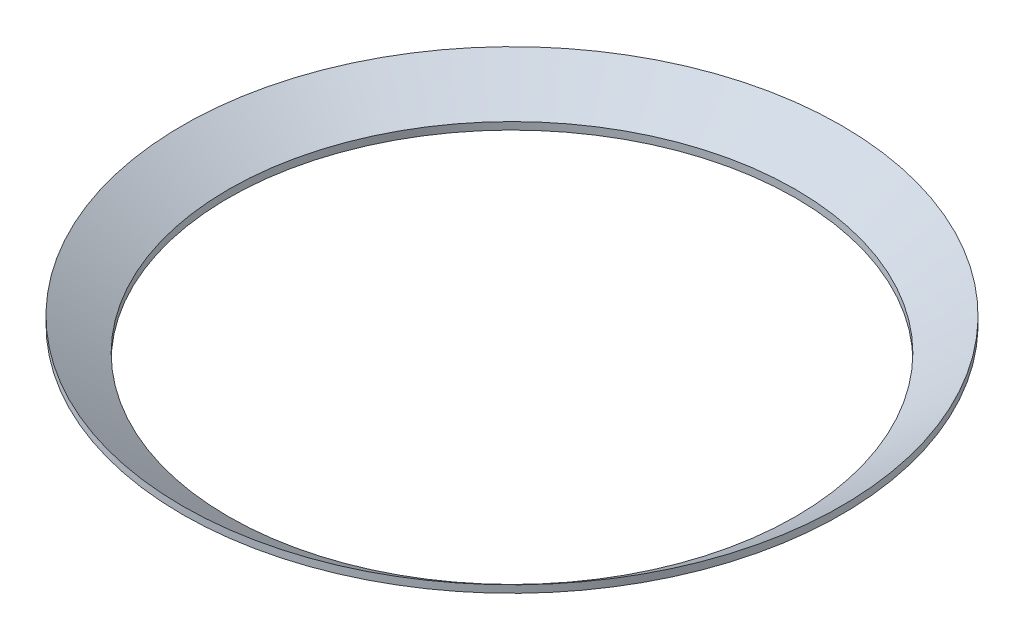
ISO-10303-21;
HEADER;
FILE_DESCRIPTION(('STEP AP214'),'2;1');
FILE_NAME('part.step','',(''),(''),'','','');
FILE_SCHEMA(('AUTOMOTIVE_DESIGN { 1 0 10303 214 1 1 1 1 }'));
ENDSEC;
DATA;
#1=APPLICATION_CONTEXT('core data for automotive mechanical design processes');
#2=APPLICATION_PROTOCOL_DEFINITION('international standard','automotive_design',2000,#1);
#3=PRODUCT_CONTEXT('',#1,'mechanical');
#4=PRODUCT('Part','Part','',(#3));
#5=PRODUCT_RELATED_PRODUCT_CATEGORY('part','',(#4));
#6=PRODUCT_DEFINITION_FORMATION('','',#4);
#7=PRODUCT_DEFINITION_CONTEXT('part definition',#1,'design');
#8=PRODUCT_DEFINITION('design','',#6,#7);
#9=PRODUCT_DEFINITION_SHAPE('','',#8);
#10=(LENGTH_UNIT() NAMED_UNIT(*) SI_UNIT(.MILLI.,.METRE.));
#11=(NAMED_UNIT(*) PLANE_ANGLE_UNIT() SI_UNIT($,.RADIAN.));
#12=(NAMED_UNIT(*) SI_UNIT($,.STERADIAN.) SOLID_ANGLE_UNIT());
#13=UNCERTAINTY_MEASURE_WITH_UNIT(LENGTH_MEASURE(1.E-05),#10,'distance_accuracy_value','');
#14=(GEOMETRIC_REPRESENTATION_CONTEXT(3) GLOBAL_UNCERTAINTY_ASSIGNED_CONTEXT((#13)) GLOBAL_UNIT_ASSIGNED_CONTEXT((#10,
#11,#12)) REPRESENTATION_CONTEXT('',''));
#15=CARTESIAN_POINT('',(0.,0.,0.));
#16=DIRECTION('',(0.,0.,1.));
#17=DIRECTION('',(1.,0.,0.));
#18=AXIS2_PLACEMENT_3D('',#15,#16,#17);
#19=CARTESIAN_POINT('',(0.,0.700207538209541,0.));
#20=DIRECTION('',(0.,1.,0.));
#21=DIRECTION('',(0.,0.,1.));
#22=AXIS2_PLACEMENT_3D('',#19,#20,#21);
#23=CONICAL_SURFACE('',#22,7.14999999999988,0.959931088596906);
#24=CARTESIAN_POINT('',(0.,-1.4213890481285E-13,0.));
#25=DIRECTION('',(0.,-1.,0.));
#26=DIRECTION('',(0.,0.,-1.));
#27=AXIS2_PLACEMENT_3D('',#24,#25,#26);
#28=CIRCLE('',#27,6.15);
#29=CARTESIAN_POINT('',(0.,-1.4213890481285E-13,-6.15));
#30=VERTEX_POINT('',#29);
#31=EDGE_CURVE('E29',#30,#30,#28,.F.);
#32=ORIENTED_EDGE('',*,*,#31,.T.);
#33=EDGE_LOOP('',(#32));
#34=FACE_BOUND('',#33,.T.);
#35=CARTESIAN_POINT('',(0.,0.700207538209696,0.));
#36=DIRECTION('',(0.,-1.,0.));
#37=DIRECTION('',(0.,0.,-1.));
#38=AXIS2_PLACEMENT_3D('',#35,#36,#37);
#39=CIRCLE('',#38,7.15);
#40=CARTESIAN_POINT('',(0.,0.700207538209696,-7.15));
#41=VERTEX_POINT('',#40);
#42=EDGE_CURVE('E24',#41,#41,#39,.F.);
#43=ORIENTED_EDGE('',*,*,#42,.F.);
#44=EDGE_LOOP('',(#43));
#45=FACE_BOUND('',#44,.T.);
#46=ADVANCED_FACE('F13',(#34,#45),#23,.T.);
#47=CARTESIAN_POINT('',(0.,0.86,0.));
#48=DIRECTION('',(0.,-1.,0.));
#49=DIRECTION('',(0.,0.,-1.));
#50=AXIS2_PLACEMENT_3D('',#47,#48,#49);
#51=CYLINDRICAL_SURFACE('',#50,6.15);
#52=ORIENTED_EDGE('',*,*,#31,.F.);
#53=EDGE_LOOP('',(#52));
#54=FACE_BOUND('',#53,.T.);
#55=CARTESIAN_POINT('',(0.,0.159792461562724,0.));
#56=DIRECTION('',(0.,1.,0.));
#57=DIRECTION('',(0.,0.,1.));
#58=AXIS2_PLACEMENT_3D('',#55,#56,#57);
#59=CIRCLE('',#58,6.14999999967403);
#60=CARTESIAN_POINT('',(0.,0.159792461562724,6.14999999967403));
#61=VERTEX_POINT('',#60);
#62=EDGE_CURVE('E16',#61,#61,#59,.T.);
#63=ORIENTED_EDGE('',*,*,#62,.T.);
#64=EDGE_LOOP('',(#63));
#65=FACE_BOUND('',#64,.T.);
#66=ADVANCED_FACE('F40',(#54,#65),#51,.F.);
#67=CARTESIAN_POINT('',(0.,0.86,0.));
#68=DIRECTION('',(0.,-1.,0.));
#69=DIRECTION('',(0.,0.,-1.));
#70=AXIS2_PLACEMENT_3D('',#67,#68,#69);
#71=CYLINDRICAL_SURFACE('',#70,7.15);
#72=CARTESIAN_POINT('',(0.,0.860000000000416,0.));
#73=DIRECTION('',(0.,1.,0.));
#74=DIRECTION('',(0.,0.,1.));
#75=AXIS2_PLACEMENT_3D('',#72,#73,#74);
#76=CIRCLE('',#75,7.14999999999966);
#77=CARTESIAN_POINT('',(0.,0.860000000000416,7.14999999999966));
#78=VERTEX_POINT('',#77);
#79=EDGE_CURVE('E9',#78,#78,#76,.F.);
#80=ORIENTED_EDGE('',*,*,#79,.T.);
#81=EDGE_LOOP('',(#80));
#82=FACE_BOUND('',#81,.T.);
#83=ORIENTED_EDGE('',*,*,#42,.T.);
#84=EDGE_LOOP('',(#83));
#85=FACE_BOUND('',#84,.T.);
#86=ADVANCED_FACE('F37',(#82,#85),#71,.T.);
#87=CARTESIAN_POINT('',(0.,0.860000000000194,0.));
#88=DIRECTION('',(0.,1.,0.));
#89=DIRECTION('',(0.,0.,1.));
#90=AXIS2_PLACEMENT_3D('',#87,#88,#89);
#91=CONICAL_SURFACE('',#90,7.14999999999932,0.959931088596921);
#92=ORIENTED_EDGE('',*,*,#79,.F.);
#93=EDGE_LOOP('',(#92));
#94=FACE_BOUND('',#93,.T.);
#95=ORIENTED_EDGE('',*,*,#62,.F.);
#96=EDGE_LOOP('',(#95));
#97=FACE_BOUND('',#96,.T.);
#98=ADVANCED_FACE('F46',(#94,#97),#91,.F.);
#99=CLOSED_SHELL('',(#46,#66,#86,#98));
#100=MANIFOLD_SOLID_BREP('B1',#99);
#101=ADVANCED_BREP_SHAPE_REPRESENTATION('',(#18,#100),#14);
#102=SHAPE_DEFINITION_REPRESENTATION(#9,#101);
ENDSEC;
END-ISO-10303-21;
